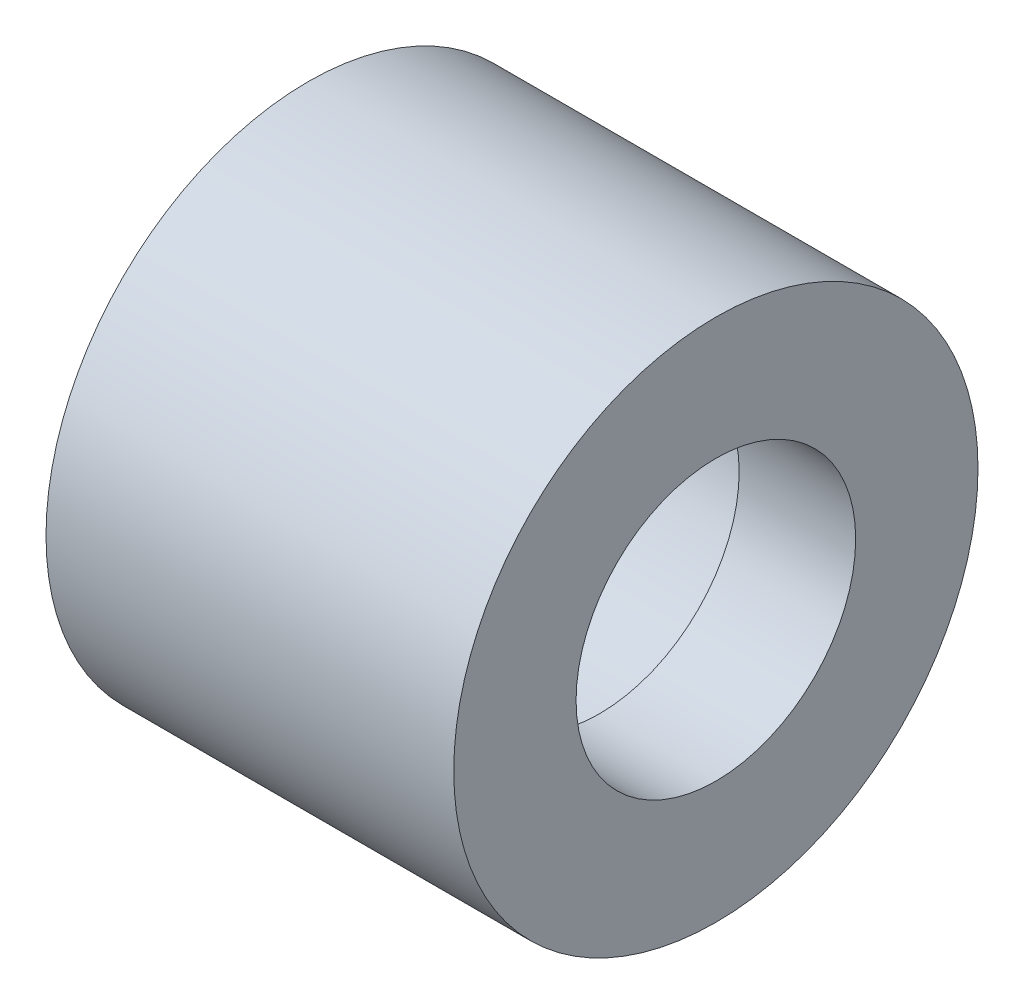
ISO-10303-21;
HEADER;
FILE_DESCRIPTION(('STEP AP214'),'2;1');
FILE_NAME('part.step','',(''),(''),'','','');
FILE_SCHEMA(('AUTOMOTIVE_DESIGN { 1 0 10303 214 1 1 1 1 }'));
ENDSEC;
DATA;
#1=APPLICATION_CONTEXT('core data for automotive mechanical design processes');
#2=APPLICATION_PROTOCOL_DEFINITION('international standard','automotive_design',2000,#1);
#3=PRODUCT_CONTEXT('',#1,'mechanical');
#4=PRODUCT('Part','Part','',(#3));
#5=PRODUCT_RELATED_PRODUCT_CATEGORY('part','',(#4));
#6=PRODUCT_DEFINITION_FORMATION('','',#4);
#7=PRODUCT_DEFINITION_CONTEXT('part definition',#1,'design');
#8=PRODUCT_DEFINITION('design','',#6,#7);
#9=PRODUCT_DEFINITION_SHAPE('','',#8);
#10=(LENGTH_UNIT() NAMED_UNIT(*) SI_UNIT(.MILLI.,.METRE.));
#11=(NAMED_UNIT(*) PLANE_ANGLE_UNIT() SI_UNIT($,.RADIAN.));
#12=(NAMED_UNIT(*) SI_UNIT($,.STERADIAN.) SOLID_ANGLE_UNIT());
#13=UNCERTAINTY_MEASURE_WITH_UNIT(LENGTH_MEASURE(1.E-05),#10,'distance_accuracy_value','');
#14=(GEOMETRIC_REPRESENTATION_CONTEXT(3) GLOBAL_UNCERTAINTY_ASSIGNED_CONTEXT((#13)) GLOBAL_UNIT_ASSIGNED_CONTEXT((#10,
#11,#12)) REPRESENTATION_CONTEXT('',''));
#15=CARTESIAN_POINT('',(0.,0.,0.));
#16=DIRECTION('',(0.,0.,1.));
#17=DIRECTION('',(1.,0.,0.));
#18=AXIS2_PLACEMENT_3D('',#15,#16,#17);
#19=CARTESIAN_POINT('',(66.,4.5,0.));
#20=DIRECTION('',(1.,0.,0.));
#21=DIRECTION('',(0.,0.,-1.));
#22=AXIS2_PLACEMENT_3D('',#19,#20,#21);
#23=PLANE('',#22);
#24=CARTESIAN_POINT('',(66.,0.,0.));
#25=DIRECTION('',(-1.,0.,0.));
#26=DIRECTION('',(0.,0.,1.));
#27=AXIS2_PLACEMENT_3D('',#24,#25,#26);
#28=CIRCLE('',#27,3.175);
#29=CARTESIAN_POINT('',(66.,0.,3.175));
#30=VERTEX_POINT('',#29);
#31=EDGE_CURVE('E10',#30,#30,#28,.T.);
#32=ORIENTED_EDGE('',*,*,#31,.F.);
#33=EDGE_LOOP('',(#32));
#34=FACE_BOUND('',#33,.T.);
#35=CARTESIAN_POINT('',(66.,0.,0.));
#36=DIRECTION('',(-1.,0.,0.));
#37=DIRECTION('',(0.,0.,1.));
#38=AXIS2_PLACEMENT_3D('',#35,#36,#37);
#39=CIRCLE('',#38,4.5);
#40=CARTESIAN_POINT('',(66.,0.,4.5));
#41=VERTEX_POINT('',#40);
#42=EDGE_CURVE('E53',#41,#41,#39,.T.);
#43=ORIENTED_EDGE('',*,*,#42,.T.);
#44=EDGE_LOOP('',(#43));
#45=FACE_BOUND('',#44,.T.);
#46=ADVANCED_FACE('F31',(#34,#45),#23,.F.);
#47=CARTESIAN_POINT('',(-110.,0.,0.));
#48=DIRECTION('',(-1.,0.,0.));
#49=DIRECTION('',(0.,0.,1.));
#50=AXIS2_PLACEMENT_3D('',#47,#48,#49);
#51=CYLINDRICAL_SURFACE('',#50,3.175);
#52=CARTESIAN_POINT('',(71.,0.,0.));
#53=DIRECTION('',(-1.,0.,0.));
#54=DIRECTION('',(0.,0.,1.));
#55=AXIS2_PLACEMENT_3D('',#52,#53,#54);
#56=CIRCLE('',#55,3.175);
#57=CARTESIAN_POINT('',(71.,0.,3.175));
#58=VERTEX_POINT('',#57);
#59=EDGE_CURVE('E37',#58,#58,#56,.T.);
#60=ORIENTED_EDGE('',*,*,#59,.F.);
#61=EDGE_LOOP('',(#60));
#62=FACE_BOUND('',#61,.T.);
#63=ORIENTED_EDGE('',*,*,#31,.T.);
#64=EDGE_LOOP('',(#63));
#65=FACE_BOUND('',#64,.T.);
#66=ADVANCED_FACE('F78',(#62,#65),#51,.F.);
#67=CARTESIAN_POINT('',(71.,3.175,0.));
#68=DIRECTION('',(1.,0.,0.));
#69=DIRECTION('',(0.,0.,-1.));
#70=AXIS2_PLACEMENT_3D('',#67,#68,#69);
#71=PLANE('',#70);
#72=CARTESIAN_POINT('',(71.,0.,0.));
#73=DIRECTION('',(-1.,0.,0.));
#74=DIRECTION('',(0.,0.,1.));
#75=AXIS2_PLACEMENT_3D('',#72,#73,#74);
#76=CIRCLE('',#75,2.4);
#77=CARTESIAN_POINT('',(71.,0.,2.4));
#78=VERTEX_POINT('',#77);
#79=EDGE_CURVE('E41',#78,#78,#76,.T.);
#80=ORIENTED_EDGE('',*,*,#79,.F.);
#81=EDGE_LOOP('',(#80));
#82=FACE_BOUND('',#81,.T.);
#83=ORIENTED_EDGE('',*,*,#59,.T.);
#84=EDGE_LOOP('',(#83));
#85=FACE_BOUND('',#84,.T.);
#86=ADVANCED_FACE('F73',(#82,#85),#71,.F.);
#87=CARTESIAN_POINT('',(-110.,0.,0.));
#88=DIRECTION('',(-1.,0.,0.));
#89=DIRECTION('',(0.,0.,1.));
#90=AXIS2_PLACEMENT_3D('',#87,#88,#89);
#91=CYLINDRICAL_SURFACE('',#90,2.4);
#92=CARTESIAN_POINT('',(73.,0.,0.));
#93=DIRECTION('',(-1.,0.,0.));
#94=DIRECTION('',(0.,0.,1.));
#95=AXIS2_PLACEMENT_3D('',#92,#93,#94);
#96=CIRCLE('',#95,2.4);
#97=CARTESIAN_POINT('',(73.,0.,2.4));
#98=VERTEX_POINT('',#97);
#99=EDGE_CURVE('E45',#98,#98,#96,.T.);
#100=ORIENTED_EDGE('',*,*,#99,.F.);
#101=EDGE_LOOP('',(#100));
#102=FACE_BOUND('',#101,.T.);
#103=ORIENTED_EDGE('',*,*,#79,.T.);
#104=EDGE_LOOP('',(#103));
#105=FACE_BOUND('',#104,.T.);
#106=ADVANCED_FACE('F67',(#102,#105),#91,.F.);
#107=CARTESIAN_POINT('',(73.,2.4,0.));
#108=DIRECTION('',(-1.,0.,0.));
#109=DIRECTION('',(0.,0.,1.));
#110=AXIS2_PLACEMENT_3D('',#107,#108,#109);
#111=PLANE('',#110);
#112=CARTESIAN_POINT('',(73.,0.,0.));
#113=DIRECTION('',(-1.,0.,0.));
#114=DIRECTION('',(0.,0.,1.));
#115=AXIS2_PLACEMENT_3D('',#112,#113,#114);
#116=CIRCLE('',#115,4.5);
#117=CARTESIAN_POINT('',(73.,0.,4.5));
#118=VERTEX_POINT('',#117);
#119=EDGE_CURVE('E50',#118,#118,#116,.T.);
#120=ORIENTED_EDGE('',*,*,#119,.F.);
#121=EDGE_LOOP('',(#120));
#122=FACE_BOUND('',#121,.T.);
#123=ORIENTED_EDGE('',*,*,#99,.T.);
#124=EDGE_LOOP('',(#123));
#125=FACE_BOUND('',#124,.T.);
#126=ADVANCED_FACE('F61',(#122,#125),#111,.F.);
#127=CARTESIAN_POINT('',(-110.,0.,0.));
#128=DIRECTION('',(-1.,0.,0.));
#129=DIRECTION('',(0.,0.,1.));
#130=AXIS2_PLACEMENT_3D('',#127,#128,#129);
#131=CYLINDRICAL_SURFACE('',#130,4.5);
#132=ORIENTED_EDGE('',*,*,#42,.F.);
#133=EDGE_LOOP('',(#132));
#134=FACE_BOUND('',#133,.T.);
#135=ORIENTED_EDGE('',*,*,#119,.T.);
#136=EDGE_LOOP('',(#135));
#137=FACE_BOUND('',#136,.T.);
#138=ADVANCED_FACE('F58',(#134,#137),#131,.T.);
#139=CLOSED_SHELL('',(#46,#66,#86,#106,#126,#138));
#140=MANIFOLD_SOLID_BREP('B2',#139);
#141=ADVANCED_BREP_SHAPE_REPRESENTATION('',(#18,#140),#14);
#142=SHAPE_DEFINITION_REPRESENTATION(#9,#141);
ENDSEC;
END-ISO-10303-21;
